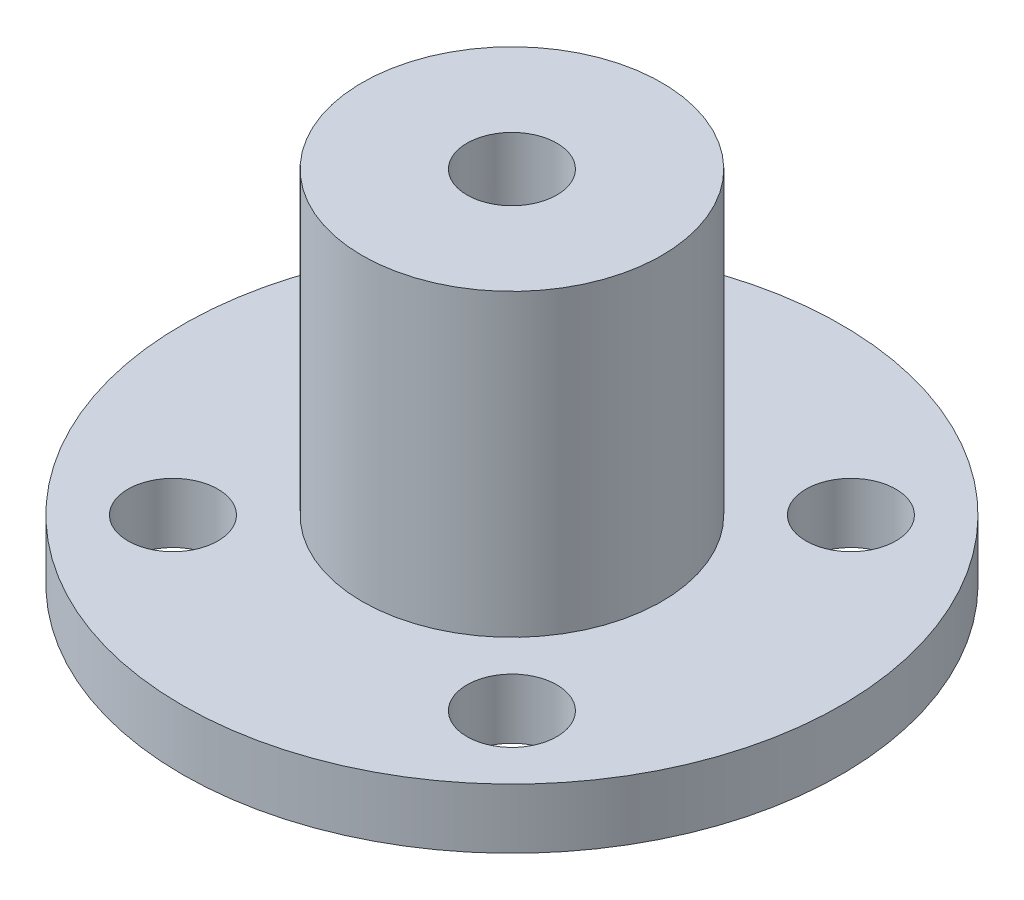
ISO-10303-21;
HEADER;
FILE_DESCRIPTION(('STEP AP214'),'2;1');
FILE_NAME('part.step','',(''),(''),'','','');
FILE_SCHEMA(('AUTOMOTIVE_DESIGN { 1 0 10303 214 1 1 1 1 }'));
ENDSEC;
DATA;
#1=APPLICATION_CONTEXT('core data for automotive mechanical design processes');
#2=APPLICATION_PROTOCOL_DEFINITION('international standard','automotive_design',2000,#1);
#3=PRODUCT_CONTEXT('',#1,'mechanical');
#4=PRODUCT('Part','Part','',(#3));
#5=PRODUCT_RELATED_PRODUCT_CATEGORY('part','',(#4));
#6=PRODUCT_DEFINITION_FORMATION('','',#4);
#7=PRODUCT_DEFINITION_CONTEXT('part definition',#1,'design');
#8=PRODUCT_DEFINITION('design','',#6,#7);
#9=PRODUCT_DEFINITION_SHAPE('','',#8);
#10=(LENGTH_UNIT() NAMED_UNIT(*) SI_UNIT(.MILLI.,.METRE.));
#11=(NAMED_UNIT(*) PLANE_ANGLE_UNIT() SI_UNIT($,.RADIAN.));
#12=(NAMED_UNIT(*) SI_UNIT($,.STERADIAN.) SOLID_ANGLE_UNIT());
#13=UNCERTAINTY_MEASURE_WITH_UNIT(LENGTH_MEASURE(1.E-05),#10,'distance_accuracy_value','');
#14=(GEOMETRIC_REPRESENTATION_CONTEXT(3) GLOBAL_UNCERTAINTY_ASSIGNED_CONTEXT((#13)) GLOBAL_UNIT_ASSIGNED_CONTEXT((#10,
#11,#12)) REPRESENTATION_CONTEXT('',''));
#15=CARTESIAN_POINT('',(0.,0.,0.));
#16=DIRECTION('',(0.,0.,1.));
#17=DIRECTION('',(1.,0.,0.));
#18=AXIS2_PLACEMENT_3D('',#15,#16,#17);
#19=CARTESIAN_POINT('',(0.,2.,0.));
#20=DIRECTION('',(0.,1.,0.));
#21=DIRECTION('',(0.,0.,1.));
#22=AXIS2_PLACEMENT_3D('',#19,#20,#21);
#23=PLANE('',#22);
#24=CARTESIAN_POINT('',(5.65685424949238,2.,5.65685424949238));
#25=DIRECTION('',(0.,1.,0.));
#26=DIRECTION('',(0.,0.,1.));
#27=AXIS2_PLACEMENT_3D('',#24,#25,#26);
#28=CIRCLE('',#27,1.5);
#29=CARTESIAN_POINT('',(5.65685424949238,2.,7.15685424949238));
#30=VERTEX_POINT('',#29);
#31=EDGE_CURVE('E85',#30,#30,#28,.T.);
#32=ORIENTED_EDGE('',*,*,#31,.F.);
#33=EDGE_LOOP('',(#32));
#34=FACE_BOUND('',#33,.T.);
#35=CARTESIAN_POINT('',(-5.65685424949238,2.,-5.65685424949238));
#36=DIRECTION('',(0.,1.,0.));
#37=DIRECTION('',(0.,0.,1.));
#38=AXIS2_PLACEMENT_3D('',#35,#36,#37);
#39=CIRCLE('',#38,1.5);
#40=CARTESIAN_POINT('',(-5.65685424949238,2.,-4.15685424949238));
#41=VERTEX_POINT('',#40);
#42=EDGE_CURVE('E97',#41,#41,#39,.T.);
#43=ORIENTED_EDGE('',*,*,#42,.F.);
#44=EDGE_LOOP('',(#43));
#45=FACE_BOUND('',#44,.T.);
#46=CARTESIAN_POINT('',(0.,2.,0.));
#47=DIRECTION('',(0.,1.,0.));
#48=DIRECTION('',(0.,0.,1.));
#49=AXIS2_PLACEMENT_3D('',#46,#47,#48);
#50=CIRCLE('',#49,11.);
#51=CARTESIAN_POINT('',(0.,2.,11.));
#52=VERTEX_POINT('',#51);
#53=EDGE_CURVE('E11',#52,#52,#50,.T.);
#54=ORIENTED_EDGE('',*,*,#53,.T.);
#55=EDGE_LOOP('',(#54));
#56=FACE_BOUND('',#55,.T.);
#57=CARTESIAN_POINT('',(5.65685424949238,2.,-5.65685424949238));
#58=DIRECTION('',(0.,1.,0.));
#59=DIRECTION('',(0.,0.,1.));
#60=AXIS2_PLACEMENT_3D('',#57,#58,#59);
#61=CIRCLE('',#60,1.5);
#62=CARTESIAN_POINT('',(5.65685424949238,2.,-4.15685424949238));
#63=VERTEX_POINT('',#62);
#64=EDGE_CURVE('E103',#63,#63,#61,.T.);
#65=ORIENTED_EDGE('',*,*,#64,.F.);
#66=EDGE_LOOP('',(#65));
#67=FACE_BOUND('',#66,.T.);
#68=CARTESIAN_POINT('',(-5.65685424949238,2.,5.65685424949238));
#69=DIRECTION('',(0.,1.,0.));
#70=DIRECTION('',(0.,0.,1.));
#71=AXIS2_PLACEMENT_3D('',#68,#69,#70);
#72=CIRCLE('',#71,1.5);
#73=CARTESIAN_POINT('',(-5.65685424949238,2.,7.15685424949238));
#74=VERTEX_POINT('',#73);
#75=EDGE_CURVE('E91',#74,#74,#72,.T.);
#76=ORIENTED_EDGE('',*,*,#75,.F.);
#77=EDGE_LOOP('',(#76));
#78=FACE_BOUND('',#77,.T.);
#79=CARTESIAN_POINT('',(0.,2.,0.));
#80=DIRECTION('',(0.,1.,0.));
#81=DIRECTION('',(0.,0.,1.));
#82=AXIS2_PLACEMENT_3D('',#79,#80,#81);
#83=CIRCLE('',#82,5.);
#84=CARTESIAN_POINT('',(0.,2.,5.));
#85=VERTEX_POINT('',#84);
#86=EDGE_CURVE('E76',#85,#85,#83,.T.);
#87=ORIENTED_EDGE('',*,*,#86,.F.);
#88=EDGE_LOOP('',(#87));
#89=FACE_BOUND('',#88,.T.);
#90=ADVANCED_FACE('F43',(#34,#45,#56,#67,#78,#89),#23,.T.);
#91=CARTESIAN_POINT('',(0.,0.,0.));
#92=DIRECTION('',(0.,1.,0.));
#93=DIRECTION('',(0.,0.,1.));
#94=AXIS2_PLACEMENT_3D('',#91,#92,#93);
#95=PLANE('',#94);
#96=CARTESIAN_POINT('',(0.,0.,0.));
#97=DIRECTION('',(0.,1.,0.));
#98=DIRECTION('',(0.,0.,1.));
#99=AXIS2_PLACEMENT_3D('',#96,#97,#98);
#100=CIRCLE('',#99,11.);
#101=CARTESIAN_POINT('',(0.,0.,11.));
#102=VERTEX_POINT('',#101);
#103=EDGE_CURVE('E57',#102,#102,#100,.T.);
#104=ORIENTED_EDGE('',*,*,#103,.F.);
#105=EDGE_LOOP('',(#104));
#106=FACE_BOUND('',#105,.T.);
#107=CARTESIAN_POINT('',(0.,0.,0.));
#108=DIRECTION('',(0.,1.,0.));
#109=DIRECTION('',(0.,0.,1.));
#110=AXIS2_PLACEMENT_3D('',#107,#108,#109);
#111=CIRCLE('',#110,1.5);
#112=CARTESIAN_POINT('',(0.,0.,1.5));
#113=VERTEX_POINT('',#112);
#114=EDGE_CURVE('E106',#113,#113,#111,.T.);
#115=ORIENTED_EDGE('',*,*,#114,.T.);
#116=EDGE_LOOP('',(#115));
#117=FACE_BOUND('',#116,.T.);
#118=CARTESIAN_POINT('',(5.65685424949238,0.,-5.65685424949238));
#119=DIRECTION('',(0.,1.,0.));
#120=DIRECTION('',(0.,0.,1.));
#121=AXIS2_PLACEMENT_3D('',#118,#119,#120);
#122=CIRCLE('',#121,1.5);
#123=CARTESIAN_POINT('',(5.65685424949238,0.,-4.15685424949238));
#124=VERTEX_POINT('',#123);
#125=EDGE_CURVE('E100',#124,#124,#122,.T.);
#126=ORIENTED_EDGE('',*,*,#125,.T.);
#127=EDGE_LOOP('',(#126));
#128=FACE_BOUND('',#127,.T.);
#129=CARTESIAN_POINT('',(-5.65685424949238,0.,-5.65685424949238));
#130=DIRECTION('',(0.,1.,0.));
#131=DIRECTION('',(0.,0.,1.));
#132=AXIS2_PLACEMENT_3D('',#129,#130,#131);
#133=CIRCLE('',#132,1.5);
#134=CARTESIAN_POINT('',(-5.65685424949238,0.,-4.15685424949238));
#135=VERTEX_POINT('',#134);
#136=EDGE_CURVE('E94',#135,#135,#133,.T.);
#137=ORIENTED_EDGE('',*,*,#136,.T.);
#138=EDGE_LOOP('',(#137));
#139=FACE_BOUND('',#138,.T.);
#140=CARTESIAN_POINT('',(-5.65685424949238,0.,5.65685424949238));
#141=DIRECTION('',(0.,1.,0.));
#142=DIRECTION('',(0.,0.,1.));
#143=AXIS2_PLACEMENT_3D('',#140,#141,#142);
#144=CIRCLE('',#143,1.5);
#145=CARTESIAN_POINT('',(-5.65685424949238,0.,7.15685424949238));
#146=VERTEX_POINT('',#145);
#147=EDGE_CURVE('E88',#146,#146,#144,.T.);
#148=ORIENTED_EDGE('',*,*,#147,.T.);
#149=EDGE_LOOP('',(#148));
#150=FACE_BOUND('',#149,.T.);
#151=CARTESIAN_POINT('',(5.65685424949238,0.,5.65685424949238));
#152=DIRECTION('',(0.,1.,0.));
#153=DIRECTION('',(0.,0.,1.));
#154=AXIS2_PLACEMENT_3D('',#151,#152,#153);
#155=CIRCLE('',#154,1.5);
#156=CARTESIAN_POINT('',(5.65685424949238,0.,7.15685424949238));
#157=VERTEX_POINT('',#156);
#158=EDGE_CURVE('E82',#157,#157,#155,.T.);
#159=ORIENTED_EDGE('',*,*,#158,.T.);
#160=EDGE_LOOP('',(#159));
#161=FACE_BOUND('',#160,.T.);
#162=ADVANCED_FACE('F114',(#106,#117,#128,#139,#150,#161),#95,.F.);
#163=CARTESIAN_POINT('',(0.,2.,0.));
#164=DIRECTION('',(0.,-1.,0.));
#165=DIRECTION('',(0.,0.,-1.));
#166=AXIS2_PLACEMENT_3D('',#163,#164,#165);
#167=CYLINDRICAL_SURFACE('',#166,11.);
#168=ORIENTED_EDGE('',*,*,#53,.F.);
#169=EDGE_LOOP('',(#168));
#170=FACE_BOUND('',#169,.T.);
#171=ORIENTED_EDGE('',*,*,#103,.T.);
#172=EDGE_LOOP('',(#171));
#173=FACE_BOUND('',#172,.T.);
#174=ADVANCED_FACE('F45',(#170,#173),#167,.T.);
#175=CARTESIAN_POINT('',(0.,2.,0.));
#176=DIRECTION('',(0.,-1.,0.));
#177=DIRECTION('',(0.,0.,-1.));
#178=AXIS2_PLACEMENT_3D('',#175,#176,#177);
#179=CYLINDRICAL_SURFACE('',#178,1.5);
#180=CARTESIAN_POINT('',(0.,8.,0.));
#181=DIRECTION('',(0.,-0.707106781186547,0.707106781186547));
#182=DIRECTION('',(0.,-0.707106781186547,-0.707106781186547));
#183=AXIS2_PLACEMENT_3D('',#180,#181,#182);
#184=ELLIPSE('',#183,2.12132034355964,1.5);
#185=CARTESIAN_POINT('',(-1.5,8.,0.));
#186=VERTEX_POINT('',#185);
#187=CARTESIAN_POINT('',(1.5,8.,0.));
#188=VERTEX_POINT('',#187);
#189=EDGE_CURVE('E64',#186,#188,#184,.T.);
#190=ORIENTED_EDGE('',*,*,#189,.F.);
#191=CARTESIAN_POINT('',(0.,8.,0.));
#192=DIRECTION('',(0.,-0.707106781186547,-0.707106781186547));
#193=DIRECTION('',(0.,-0.707106781186547,0.707106781186547));
#194=AXIS2_PLACEMENT_3D('',#191,#192,#193);
#195=ELLIPSE('',#194,2.12132034355964,1.5);
#196=EDGE_CURVE('E66',#188,#186,#195,.F.);
#197=ORIENTED_EDGE('',*,*,#196,.F.);
#198=EDGE_LOOP('',(#190,#197));
#199=FACE_BOUND('',#198,.T.);
#200=ORIENTED_EDGE('',*,*,#114,.F.);
#201=EDGE_LOOP('',(#200));
#202=FACE_BOUND('',#201,.T.);
#203=CARTESIAN_POINT('',(0.,12.,0.));
#204=DIRECTION('',(0.,1.,0.));
#205=DIRECTION('',(0.,0.,1.));
#206=AXIS2_PLACEMENT_3D('',#203,#204,#205);
#207=CIRCLE('',#206,1.5);
#208=CARTESIAN_POINT('',(0.,12.,1.5));
#209=VERTEX_POINT('',#208);
#210=EDGE_CURVE('E73',#209,#209,#207,.T.);
#211=ORIENTED_EDGE('',*,*,#210,.T.);
#212=EDGE_LOOP('',(#211));
#213=FACE_BOUND('',#212,.T.);
#214=ADVANCED_FACE('F71',(#199,#202,#213),#179,.F.);
#215=CARTESIAN_POINT('',(5.65685424949238,2.,-5.65685424949238));
#216=DIRECTION('',(0.,-1.,0.));
#217=DIRECTION('',(0.,0.,-1.));
#218=AXIS2_PLACEMENT_3D('',#215,#216,#217);
#219=CYLINDRICAL_SURFACE('',#218,1.5);
#220=ORIENTED_EDGE('',*,*,#64,.T.);
#221=EDGE_LOOP('',(#220));
#222=FACE_BOUND('',#221,.T.);
#223=ORIENTED_EDGE('',*,*,#125,.F.);
#224=EDGE_LOOP('',(#223));
#225=FACE_BOUND('',#224,.T.);
#226=ADVANCED_FACE('F153',(#222,#225),#219,.F.);
#227=CARTESIAN_POINT('',(-5.65685424949238,2.,-5.65685424949238));
#228=DIRECTION('',(0.,-1.,0.));
#229=DIRECTION('',(0.,0.,-1.));
#230=AXIS2_PLACEMENT_3D('',#227,#228,#229);
#231=CYLINDRICAL_SURFACE('',#230,1.5);
#232=ORIENTED_EDGE('',*,*,#42,.T.);
#233=EDGE_LOOP('',(#232));
#234=FACE_BOUND('',#233,.T.);
#235=ORIENTED_EDGE('',*,*,#136,.F.);
#236=EDGE_LOOP('',(#235));
#237=FACE_BOUND('',#236,.T.);
#238=ADVANCED_FACE('F140',(#234,#237),#231,.F.);
#239=CARTESIAN_POINT('',(-5.65685424949238,2.,5.65685424949238));
#240=DIRECTION('',(0.,-1.,0.));
#241=DIRECTION('',(0.,0.,-1.));
#242=AXIS2_PLACEMENT_3D('',#239,#240,#241);
#243=CYLINDRICAL_SURFACE('',#242,1.5);
#244=ORIENTED_EDGE('',*,*,#75,.T.);
#245=EDGE_LOOP('',(#244));
#246=FACE_BOUND('',#245,.T.);
#247=ORIENTED_EDGE('',*,*,#147,.F.);
#248=EDGE_LOOP('',(#247));
#249=FACE_BOUND('',#248,.T.);
#250=ADVANCED_FACE('F130',(#246,#249),#243,.F.);
#251=CARTESIAN_POINT('',(5.65685424949238,2.,5.65685424949238));
#252=DIRECTION('',(0.,-1.,0.));
#253=DIRECTION('',(0.,0.,-1.));
#254=AXIS2_PLACEMENT_3D('',#251,#252,#253);
#255=CYLINDRICAL_SURFACE('',#254,1.5);
#256=ORIENTED_EDGE('',*,*,#31,.T.);
#257=EDGE_LOOP('',(#256));
#258=FACE_BOUND('',#257,.T.);
#259=ORIENTED_EDGE('',*,*,#158,.F.);
#260=EDGE_LOOP('',(#259));
#261=FACE_BOUND('',#260,.T.);
#262=ADVANCED_FACE('F127',(#258,#261),#255,.F.);
#263=CARTESIAN_POINT('',(0.,12.,0.));
#264=DIRECTION('',(0.,1.,0.));
#265=DIRECTION('',(0.,0.,1.));
#266=AXIS2_PLACEMENT_3D('',#263,#264,#265);
#267=PLANE('',#266);
#268=CARTESIAN_POINT('',(0.,12.,0.));
#269=DIRECTION('',(0.,1.,0.));
#270=DIRECTION('',(0.,0.,1.));
#271=AXIS2_PLACEMENT_3D('',#268,#269,#270);
#272=CIRCLE('',#271,5.);
#273=CARTESIAN_POINT('',(0.,12.,5.));
#274=VERTEX_POINT('',#273);
#275=EDGE_CURVE('E79',#274,#274,#272,.T.);
#276=ORIENTED_EDGE('',*,*,#275,.T.);
#277=EDGE_LOOP('',(#276));
#278=FACE_BOUND('',#277,.T.);
#279=ORIENTED_EDGE('',*,*,#210,.F.);
#280=EDGE_LOOP('',(#279));
#281=FACE_BOUND('',#280,.T.);
#282=ADVANCED_FACE('F129',(#278,#281),#267,.T.);
#283=CARTESIAN_POINT('',(0.,12.,0.));
#284=DIRECTION('',(0.,-1.,0.));
#285=DIRECTION('',(0.,0.,-1.));
#286=AXIS2_PLACEMENT_3D('',#283,#284,#285);
#287=CYLINDRICAL_SURFACE('',#286,5.);
#288=CARTESIAN_POINT('',(0.,9.5,-5.));
#289=CARTESIAN_POINT('',(-0.0822886127533,9.49999900251511,-4.9999992925055));
#290=CARTESIAN_POINT('',(-0.16458731835153,9.49320613637603,-4.99794915693954));
#291=CARTESIAN_POINT('',(-0.326788125304881,9.4662786457779,-4.98997105593691));
#292=CARTESIAN_POINT('',(-0.40668950441142,9.44614004197666,-4.98404193389692));
#293=CARTESIAN_POINT('',(-0.561732707754526,9.39325398308974,-4.96895552501836));
#294=CARTESIAN_POINT('',(-0.636881364395373,9.36052513038106,-4.95980300250425));
#295=CARTESIAN_POINT('',(-0.780624181053131,9.28346390694416,-4.93922109237645));
#296=CARTESIAN_POINT('',(-0.849217467469669,9.23912999260458,-4.92779140192067));
#297=CARTESIAN_POINT('',(-0.979871797183745,9.13877599252733,-4.90350737192774));
#298=CARTESIAN_POINT('',(-1.04171807124434,9.08248337411409,-4.89062383657036));
#299=CARTESIAN_POINT('',(-1.15524920923324,8.96039077008981,-4.86505834210442));
#300=CARTESIAN_POINT('',(-1.20693236327441,8.89458918787504,-4.85237641724501));
#301=CARTESIAN_POINT('',(-1.29980037723708,8.75352924696239,-4.82834113993772));
#302=CARTESIAN_POINT('',(-1.34072309022213,8.67809153900926,-4.81702406663875));
#303=CARTESIAN_POINT('',(-1.4092139477476,8.52101074576971,-4.79743620394031));
#304=CARTESIAN_POINT('',(-1.43678529919973,8.43936915607203,-4.78916468313311));
#305=CARTESIAN_POINT('',(-1.47701633682652,8.27460973386954,-4.77690870838434));
#306=CARTESIAN_POINT('',(-1.49007196234677,8.19159725613606,-4.77281069324533));
#307=CARTESIAN_POINT('',(-1.50213730614672,8.02446684378323,-4.76902789749767));
#308=CARTESIAN_POINT('',(-1.50115042761078,7.94034918194091,-4.76934204760571));
#309=CARTESIAN_POINT('',(-1.48546977199812,7.77661609139152,-4.77424744067778));
#310=CARTESIAN_POINT('',(-1.47127205262685,7.69694774963776,-4.77868388599141));
#311=CARTESIAN_POINT('',(-1.43037420427056,7.54118021372654,-4.79108356228624));
#312=CARTESIAN_POINT('',(-1.40367284141641,7.46508137262567,-4.79904714132351));
#313=CARTESIAN_POINT('',(-1.33816026653682,7.31739965033926,-4.81772733074973));
#314=CARTESIAN_POINT('',(-1.29918816934642,7.24589291604474,-4.82848016115952));
#315=CARTESIAN_POINT('',(-1.21035222588683,7.11026797798981,-4.85150987000065));
#316=CARTESIAN_POINT('',(-1.16048574002588,7.04615157058622,-4.86378711746991));
#317=CARTESIAN_POINT('',(-1.04881290765546,6.92431380923798,-4.88911011297937));
#318=CARTESIAN_POINT('',(-0.986594907466971,6.86697133597033,-4.90216654310498));
#319=CARTESIAN_POINT('',(-0.853263259313965,6.76344601593575,-4.92712244063259));
#320=CARTESIAN_POINT('',(-0.782149051860886,6.71726387158557,-4.9390218351841));
#321=CARTESIAN_POINT('',(-0.632355038342802,6.63714007753527,-4.9604316006947));
#322=CARTESIAN_POINT('',(-0.553627749747949,6.60328248375014,-4.96992543668314));
#323=CARTESIAN_POINT('',(-0.391245415603518,6.54940040990037,-4.98533521832222));
#324=CARTESIAN_POINT('',(-0.30759175158958,6.52937207146751,-4.99125216186999));
#325=CARTESIAN_POINT('',(-0.14095224266833,6.50434782210061,-4.99868364643538));
#326=CARTESIAN_POINT('',(-0.0580500976011858,6.49883841419839,-5.0003485041779));
#327=CARTESIAN_POINT('',(0.107499605823384,6.50156915571208,-4.9995292324176));
#328=CARTESIAN_POINT('',(0.190147196690782,6.50980746965144,-4.99704565677756));
#329=CARTESIAN_POINT('',(0.350903605309698,6.5393846111115,-4.98830696987163));
#330=CARTESIAN_POINT('',(0.429072772614171,6.56042338758087,-4.98213829799417));
#331=CARTESIAN_POINT('',(0.580754638954524,6.6146432327782,-4.96674347841533));
#332=CARTESIAN_POINT('',(0.654266777025585,6.64782576103786,-4.95751696321085));
#333=CARTESIAN_POINT('',(0.796437189461053,6.72625316548113,-4.93669654351325));
#334=CARTESIAN_POINT('',(0.864943826199671,6.77175934094797,-4.92505280829675));
#335=CARTESIAN_POINT('',(0.993523307980148,6.87322475405281,-4.90073468764317));
#336=CARTESIAN_POINT('',(1.05359403235594,6.92918661188767,-4.8880600443108));
#337=CARTESIAN_POINT('',(1.16585744551027,7.05238730836935,-4.86253171869138));
#338=CARTESIAN_POINT('',(1.21768481231504,7.11996187577174,-4.84968825033268));
#339=CARTESIAN_POINT('',(1.30928995072154,7.26312793901353,-4.82576515238464));
#340=CARTESIAN_POINT('',(1.34906803829472,7.33871922455821,-4.81468547654651));
#341=CARTESIAN_POINT('',(1.41517347127168,7.49553249125469,-4.79567189615055));
#342=CARTESIAN_POINT('',(1.4415634693705,7.57672618653659,-4.78772337843827));
#343=CARTESIAN_POINT('',(1.48021730815114,7.74268796893148,-4.77591594362794));
#344=CARTESIAN_POINT('',(1.49248598978779,7.82745482078767,-4.772055625083));
#345=CARTESIAN_POINT('',(1.50221984485059,7.99436151837623,-4.76899972496087));
#346=CARTESIAN_POINT('',(1.5002805530849,8.07646365101759,-4.76961647442754));
#347=CARTESIAN_POINT('',(1.48307505444813,8.2391141033728,-4.77499401288294));
#348=CARTESIAN_POINT('',(1.46780938124716,8.31966248517635,-4.77975463592551));
#349=CARTESIAN_POINT('',(1.42476888804136,8.47594539914285,-4.79275763670385));
#350=CARTESIAN_POINT('',(1.39715175507068,8.55172728736169,-4.80095604545965));
#351=CARTESIAN_POINT('',(1.33031507121129,8.69764243881772,-4.81990278909136));
#352=CARTESIAN_POINT('',(1.29109329962876,8.76777461764076,-4.83065161194312));
#353=CARTESIAN_POINT('',(1.20048763805072,8.90316311652711,-4.85397676425833));
#354=CARTESIAN_POINT('',(1.14871276092994,8.96814876126041,-4.86660540163798));
#355=CARTESIAN_POINT('',(1.03517434629782,9.08870249830787,-4.89201320450026));
#356=CARTESIAN_POINT('',(0.973408217134499,9.14426813946776,-4.90479240823905));
#357=CARTESIAN_POINT('',(0.839465762183247,9.24602341229503,-4.92950936570649));
#358=CARTESIAN_POINT('',(0.767037885790607,9.29189144685549,-4.94141159765674));
#359=CARTESIAN_POINT('',(0.615141373983529,9.37073516990403,-4.96260680455813));
#360=CARTESIAN_POINT('',(0.535676052998955,9.40371688827451,-4.97190099931067));
#361=CARTESIAN_POINT('',(0.380757712655281,9.45289527565275,-4.98602174969301));
#362=CARTESIAN_POINT('',(0.305786961954234,9.47051167288325,-4.99122027381068));
#363=CARTESIAN_POINT('',(0.153880195230779,9.49406352524158,-4.99820944494492));
#364=CARTESIAN_POINT('',(0.0769445098581396,9.50000093270482,-5.0000006615474));
#365=CARTESIAN_POINT('',(0.,9.5,-5.));
#366=B_SPLINE_CURVE_WITH_KNOTS('',3,(#288,#289,#290,#291,#292,#293,#294,#295,#296,#297,#298,
#299,#300,#301,#302,#303,#304,#305,#306,#307,#308,#309,#310,#311,#312,#313,#314,#315,#316,#317,
#318,#319,#320,#321,#322,#323,#324,#325,#326,#327,#328,#329,#330,#331,#332,#333,#334,#335,#336,
#337,#338,#339,#340,#341,#342,#343,#344,#345,#346,#347,#348,#349,#350,#351,#352,#353,#354,#355,
#356,#357,#358,#359,#360,#361,#362,#363,#364,#365),.UNSPECIFIED.,.T.,.F.,(4,2,2,2,2,2,2,2,2,2,2,
2,2,2,2,2,2,2,2,2,2,2,2,2,2,2,2,2,2,2,2,2,2,2,2,2,2,2,4),(0.,0.246583203612611,0.493239964846,
0.739533676300874,0.985860164412702,1.23855602948192,1.49129437288633,1.74971481004109,
2.00807314543223,2.25919689356599,2.51025978319089,2.75226016697676,2.99428443658001,
3.23962426447119,3.48502360158555,3.74067104048167,3.99633456531071,4.25371046881689,
4.51101453528808,4.75908809438545,5.00712853550327,5.24956746682327,5.49203554593728,
5.74011305702908,5.98825282000191,6.24540400322818,6.5025484425268,6.75847814951252,
7.01432009460283,7.25950155466943,7.504673196616,7.74680040402721,7.98897397553107,
8.23996925679931,8.49102974897502,8.74942996156671,9.00770911595235,9.23831691930459,
9.46888616948874),.UNSPECIFIED.);
#367=CARTESIAN_POINT('',(0.,9.5,-5.));
#368=VERTEX_POINT('',#367);
#369=EDGE_CURVE('E47',#368,#368,#366,.T.);
#370=ORIENTED_EDGE('',*,*,#369,.T.);
#371=EDGE_LOOP('',(#370));
#372=FACE_BOUND('',#371,.T.);
#373=ORIENTED_EDGE('',*,*,#275,.F.);
#374=EDGE_LOOP('',(#373));
#375=FACE_BOUND('',#374,.T.);
#376=ORIENTED_EDGE('',*,*,#86,.T.);
#377=EDGE_LOOP('',(#376));
#378=FACE_BOUND('',#377,.T.);
#379=ADVANCED_FACE('F137',(#372,#375,#378),#287,.T.);
#380=CARTESIAN_POINT('',(0.,8.,-8.));
#381=DIRECTION('',(0.,0.,1.));
#382=DIRECTION('',(1.,0.,0.));
#383=AXIS2_PLACEMENT_3D('',#380,#381,#382);
#384=CYLINDRICAL_SURFACE('',#383,1.5);
#385=ORIENTED_EDGE('',*,*,#189,.T.);
#386=ORIENTED_EDGE('',*,*,#196,.T.);
#387=EDGE_LOOP('',(#385,#386));
#388=FACE_BOUND('',#387,.T.);
#389=ORIENTED_EDGE('',*,*,#369,.F.);
#390=EDGE_LOOP('',(#389));
#391=FACE_BOUND('',#390,.T.);
#392=ADVANCED_FACE('F67',(#388,#391),#384,.F.);
#393=CLOSED_SHELL('',(#90,#162,#174,#214,#226,#238,#250,#262,#282,#379,#392));
#394=MANIFOLD_SOLID_BREP('B2',#393);
#395=ADVANCED_BREP_SHAPE_REPRESENTATION('',(#18,#394),#14);
#396=SHAPE_DEFINITION_REPRESENTATION(#9,#395);
ENDSEC;
END-ISO-10303-21;
